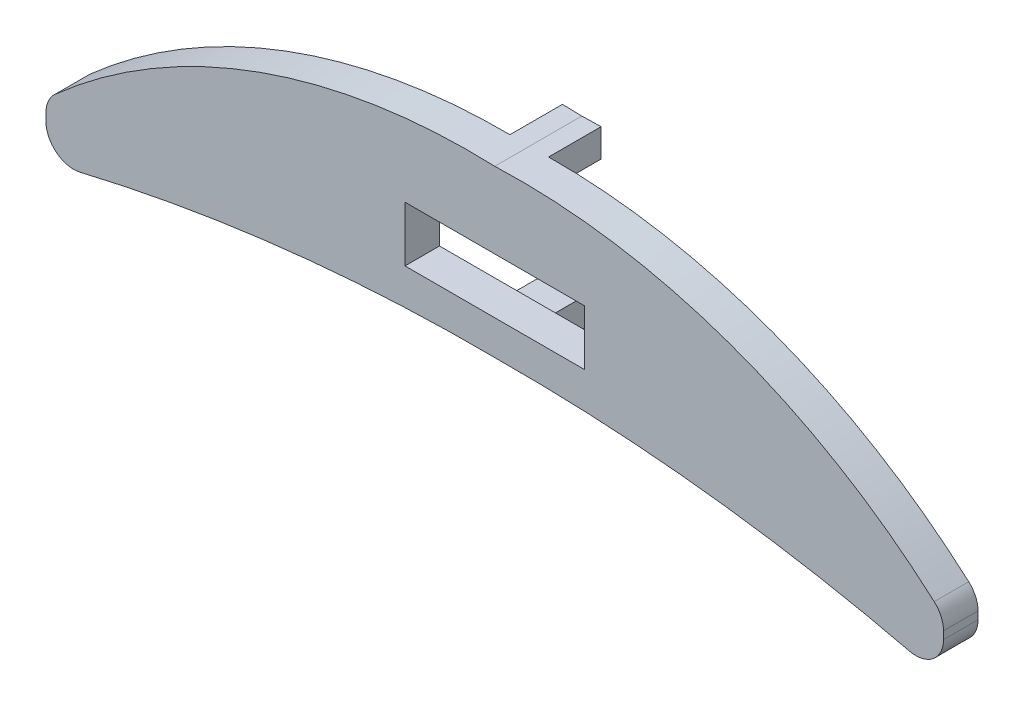
ISO-10303-21;
HEADER;
FILE_DESCRIPTION(('STEP AP214'),'2;1');
FILE_NAME('part.step','',(''),(''),'','','');
FILE_SCHEMA(('AUTOMOTIVE_DESIGN { 1 0 10303 214 1 1 1 1 }'));
ENDSEC;
DATA;
#1=APPLICATION_CONTEXT('core data for automotive mechanical design processes');
#2=APPLICATION_PROTOCOL_DEFINITION('international standard','automotive_design',2000,#1);
#3=PRODUCT_CONTEXT('',#1,'mechanical');
#4=PRODUCT('Part','Part','',(#3));
#5=PRODUCT_RELATED_PRODUCT_CATEGORY('part','',(#4));
#6=PRODUCT_DEFINITION_FORMATION('','',#4);
#7=PRODUCT_DEFINITION_CONTEXT('part definition',#1,'design');
#8=PRODUCT_DEFINITION('design','',#6,#7);
#9=PRODUCT_DEFINITION_SHAPE('','',#8);
#10=(LENGTH_UNIT() NAMED_UNIT(*) SI_UNIT(.MILLI.,.METRE.));
#11=(NAMED_UNIT(*) PLANE_ANGLE_UNIT() SI_UNIT($,.RADIAN.));
#12=(NAMED_UNIT(*) SI_UNIT($,.STERADIAN.) SOLID_ANGLE_UNIT());
#13=UNCERTAINTY_MEASURE_WITH_UNIT(LENGTH_MEASURE(1.E-05),#10,'distance_accuracy_value','');
#14=(GEOMETRIC_REPRESENTATION_CONTEXT(3) GLOBAL_UNCERTAINTY_ASSIGNED_CONTEXT((#13)) GLOBAL_UNIT_ASSIGNED_CONTEXT((#10,
#11,#12)) REPRESENTATION_CONTEXT('',''));
#15=CARTESIAN_POINT('',(0.,0.,0.));
#16=DIRECTION('',(0.,0.,1.));
#17=DIRECTION('',(1.,0.,0.));
#18=AXIS2_PLACEMENT_3D('',#15,#16,#17);
#19=CARTESIAN_POINT('',(-34.2647186257615,-33.2309703885627,2.5));
#20=DIRECTION('',(0.,0.,-1.));
#21=DIRECTION('',(-1.,0.,0.));
#22=AXIS2_PLACEMENT_3D('',#19,#20,#21);
#23=CYLINDRICAL_SURFACE('',#22,45.2653831765417);
#24=CARTESIAN_POINT('',(-34.2647186257615,-33.2309703885627,0.));
#25=DIRECTION('',(0.,0.,1.));
#26=DIRECTION('',(1.,0.,0.));
#27=AXIS2_PLACEMENT_3D('',#24,#25,#26);
#28=CIRCLE('',#27,45.2653831765417);
#29=CARTESIAN_POINT('',(-64.3283266789519,0.60886390392887,0.));
#30=VERTEX_POINT('',#29);
#31=CARTESIAN_POINT('',(-33.9,12.0329434329703,0.));
#32=VERTEX_POINT('',#31);
#33=EDGE_CURVE('E303',#30,#32,#28,.F.);
#34=ORIENTED_EDGE('',*,*,#33,.F.);
#35=CARTESIAN_POINT('',(-64.3283266789519,0.608863903928872,2.625));
#36=CARTESIAN_POINT('',(-64.3283266789519,0.608863903928872,1.70833333333333));
#37=CARTESIAN_POINT('',(-64.3283266789519,0.608863903928872,0.791666666666668));
#38=CARTESIAN_POINT('',(-64.3283266789519,0.608863903928872,-0.125));
#39=(BOUNDED_CURVE() B_SPLINE_CURVE(3,(#35,#36,#37,#38),.UNSPECIFIED.,.F.,
.F.) B_SPLINE_CURVE_WITH_KNOTS((4,4),(-0.000125,0.002625),
.UNSPECIFIED.) CURVE() GEOMETRIC_REPRESENTATION_ITEM() RATIONAL_B_SPLINE_CURVE((1.,1.,1.,1.)) REPRESENTATION_ITEM(''));
#40=CARTESIAN_POINT('',(-64.3283266789519,0.608863903928857,2.5));
#41=VERTEX_POINT('',#40);
#42=EDGE_CURVE('E11',#30,#41,#39,.F.);
#43=ORIENTED_EDGE('',*,*,#42,.T.);
#44=CARTESIAN_POINT('',(-34.2647186257615,-33.2309703885627,2.5));
#45=DIRECTION('',(0.,0.,1.));
#46=DIRECTION('',(1.,0.,0.));
#47=AXIS2_PLACEMENT_3D('',#44,#45,#46);
#48=CIRCLE('',#47,45.2653831765417);
#49=CARTESIAN_POINT('',(-32.5,12.,2.5));
#50=VERTEX_POINT('',#49);
#51=EDGE_CURVE('E315',#41,#50,#48,.F.);
#52=ORIENTED_EDGE('',*,*,#51,.T.);
#53=DIRECTION('',(0.,0.,-1.));
#54=VECTOR('',#53,1.);
#55=CARTESIAN_POINT('',(-32.5,12.,2.5));
#56=LINE('',#55,#54);
#57=CARTESIAN_POINT('',(-32.5,12.,-3.8));
#58=VERTEX_POINT('',#57);
#59=EDGE_CURVE('E549',#50,#58,#56,.T.);
#60=ORIENTED_EDGE('',*,*,#59,.T.);
#61=CARTESIAN_POINT('',(-34.2647186257615,-33.2309703885627,-3.8));
#62=DIRECTION('',(0.,0.,-1.));
#63=DIRECTION('',(-1.,0.,0.));
#64=AXIS2_PLACEMENT_3D('',#61,#62,#63);
#65=CIRCLE('',#64,45.2653831765417);
#66=CARTESIAN_POINT('',(-33.9,12.0329434329703,-3.8));
#67=VERTEX_POINT('',#66);
#68=EDGE_CURVE('E255',#67,#58,#65,.T.);
#69=ORIENTED_EDGE('',*,*,#68,.F.);
#70=DIRECTION('',(0.,0.,1.));
#71=VECTOR('',#70,1.);
#72=CARTESIAN_POINT('',(-33.9,12.0329434329703,-3.8));
#73=LINE('',#72,#71);
#74=EDGE_CURVE('E270',#67,#32,#73,.T.);
#75=ORIENTED_EDGE('',*,*,#74,.T.);
#76=EDGE_LOOP('',(#34,#43,#52,#60,#69,#75));
#77=FACE_BOUND('',#76,.T.);
#78=ADVANCED_FACE('F35',(#77),#23,.T.);
#79=CARTESIAN_POINT('',(-65.,0.,2.5));
#80=DIRECTION('',(1.,0.,0.));
#81=DIRECTION('',(0.,0.,-1.));
#82=AXIS2_PLACEMENT_3D('',#79,#80,#81);
#83=PLANE('',#82);
#84=DIRECTION('',(0.,-1.,0.));
#85=VECTOR('',#84,1.);
#86=CARTESIAN_POINT('',(-65.,0.,0.));
#87=LINE('',#86,#85);
#88=CARTESIAN_POINT('',(-65.,-0.886311080474163,0.));
#89=VERTEX_POINT('',#88);
#90=CARTESIAN_POINT('',(-65.,-1.44311489166448,0.));
#91=VERTEX_POINT('',#90);
#92=EDGE_CURVE('E646',#89,#91,#87,.T.);
#93=ORIENTED_EDGE('',*,*,#92,.T.);
#94=CARTESIAN_POINT('',(-65.,-1.44311489166448,2.625));
#95=CARTESIAN_POINT('',(-65.,-1.44311489166448,1.70833333333333));
#96=CARTESIAN_POINT('',(-65.,-1.44311489166448,0.791666666666668));
#97=CARTESIAN_POINT('',(-65.,-1.44311489166448,-0.125));
#98=(BOUNDED_CURVE() B_SPLINE_CURVE(3,(#94,#95,#96,#97),.UNSPECIFIED.,.F.,
.F.) B_SPLINE_CURVE_WITH_KNOTS((4,4),(-0.000125,0.002625),
.UNSPECIFIED.) CURVE() GEOMETRIC_REPRESENTATION_ITEM() RATIONAL_B_SPLINE_CURVE((1.,1.,1.,1.)) REPRESENTATION_ITEM(''));
#99=CARTESIAN_POINT('',(-65.,-1.44311489166448,2.5));
#100=VERTEX_POINT('',#99);
#101=EDGE_CURVE('E48',#91,#100,#98,.F.);
#102=ORIENTED_EDGE('',*,*,#101,.T.);
#103=DIRECTION('',(0.,-1.,0.));
#104=VECTOR('',#103,1.);
#105=CARTESIAN_POINT('',(-65.,0.,2.5));
#106=LINE('',#105,#104);
#107=CARTESIAN_POINT('',(-65.,-0.886311080474163,2.5));
#108=VERTEX_POINT('',#107);
#109=EDGE_CURVE('E319',#108,#100,#106,.T.);
#110=ORIENTED_EDGE('',*,*,#109,.F.);
#111=CARTESIAN_POINT('',(-65.,-0.886311080474163,-0.125));
#112=CARTESIAN_POINT('',(-65.,-0.886311080474163,0.791666666666668));
#113=CARTESIAN_POINT('',(-65.,-0.886311080474163,1.70833333333333));
#114=CARTESIAN_POINT('',(-65.,-0.886311080474163,2.625));
#115=(BOUNDED_CURVE() B_SPLINE_CURVE(3,(#111,#112,#113,#114),.UNSPECIFIED.,.F.,
.F.) B_SPLINE_CURVE_WITH_KNOTS((4,4),(-0.000125,0.002625),
.UNSPECIFIED.) CURVE() GEOMETRIC_REPRESENTATION_ITEM() RATIONAL_B_SPLINE_CURVE((1.,1.,1.,1.)) REPRESENTATION_ITEM(''));
#116=EDGE_CURVE('E523',#108,#89,#115,.F.);
#117=ORIENTED_EDGE('',*,*,#116,.T.);
#118=EDGE_LOOP('',(#93,#102,#110,#117));
#119=FACE_BOUND('',#118,.T.);
#120=ADVANCED_FACE('F678',(#119),#83,.F.);
#121=CARTESIAN_POINT('',(-33.5584917745498,-125.431004331783,2.5));
#122=DIRECTION('',(0.,0.,-1.));
#123=DIRECTION('',(-1.,0.,0.));
#124=AXIS2_PLACEMENT_3D('',#121,#122,#123);
#125=CYLINDRICAL_SURFACE('',#124,125.435470471939);
#126=CARTESIAN_POINT('',(-33.5584917745498,-125.431004331783,2.5));
#127=DIRECTION('',(0.,0.,1.));
#128=DIRECTION('',(1.,0.,0.));
#129=AXIS2_PLACEMENT_3D('',#126,#127,#128);
#130=CIRCLE('',#129,125.435470471939);
#131=CARTESIAN_POINT('',(-62.5379385642566,-3.38900780485338,2.5));
#132=VERTEX_POINT('',#131);
#133=CARTESIAN_POINT('',(-32.5,0.,2.5));
#134=VERTEX_POINT('',#133);
#135=EDGE_CURVE('E326',#132,#134,#130,.F.);
#136=ORIENTED_EDGE('',*,*,#135,.F.);
#137=CARTESIAN_POINT('',(-62.5379385642566,-3.38900780485337,-0.125));
#138=CARTESIAN_POINT('',(-62.5379385642566,-3.38900780485337,0.791666666666668));
#139=CARTESIAN_POINT('',(-62.5379385642566,-3.38900780485337,1.70833333333333));
#140=CARTESIAN_POINT('',(-62.5379385642566,-3.38900780485337,2.625));
#141=(BOUNDED_CURVE() B_SPLINE_CURVE(3,(#137,#138,#139,#140),.UNSPECIFIED.,.F.,
.F.) B_SPLINE_CURVE_WITH_KNOTS((4,4),(-0.000125,0.002625),
.UNSPECIFIED.) CURVE() GEOMETRIC_REPRESENTATION_ITEM() RATIONAL_B_SPLINE_CURVE((1.,1.,1.,1.)) REPRESENTATION_ITEM(''));
#142=CARTESIAN_POINT('',(-62.5379385642566,-3.38900780485338,0.));
#143=VERTEX_POINT('',#142);
#144=EDGE_CURVE('E644',#132,#143,#141,.F.);
#145=ORIENTED_EDGE('',*,*,#144,.T.);
#146=CARTESIAN_POINT('',(-33.5584917745498,-125.431004331783,0.));
#147=DIRECTION('',(0.,0.,1.));
#148=DIRECTION('',(1.,0.,0.));
#149=AXIS2_PLACEMENT_3D('',#146,#147,#148);
#150=CIRCLE('',#149,125.435470471939);
#151=CARTESIAN_POINT('',(-32.5,0.,0.));
#152=VERTEX_POINT('',#151);
#153=EDGE_CURVE('E590',#143,#152,#150,.F.);
#154=ORIENTED_EDGE('',*,*,#153,.T.);
#155=DIRECTION('',(0.,0.,-1.));
#156=VECTOR('',#155,1.);
#157=CARTESIAN_POINT('',(-32.5,0.,2.5));
#158=LINE('',#157,#156);
#159=EDGE_CURVE('E550',#134,#152,#158,.T.);
#160=ORIENTED_EDGE('',*,*,#159,.F.);
#161=EDGE_LOOP('',(#136,#145,#154,#160));
#162=FACE_BOUND('',#161,.T.);
#163=ADVANCED_FACE('F643',(#162),#125,.F.);
#164=CARTESIAN_POINT('',(-31.4415082254502,-125.431004331783,2.5));
#165=DIRECTION('',(0.,0.,-1.));
#166=DIRECTION('',(-1.,0.,0.));
#167=AXIS2_PLACEMENT_3D('',#164,#165,#166);
#168=CYLINDRICAL_SURFACE('',#167,125.435470471939);
#169=CARTESIAN_POINT('',(-31.4415082254502,-125.431004331783,0.));
#170=DIRECTION('',(0.,0.,1.));
#171=DIRECTION('',(1.,0.,0.));
#172=AXIS2_PLACEMENT_3D('',#169,#170,#171);
#173=CIRCLE('',#172,125.435470471939);
#174=CARTESIAN_POINT('',(-2.46206143574342,-3.38900780485336,0.));
#175=VERTEX_POINT('',#174);
#176=EDGE_CURVE('E354',#175,#152,#173,.T.);
#177=ORIENTED_EDGE('',*,*,#176,.F.);
#178=CARTESIAN_POINT('',(-2.46206143574342,-3.38900780485337,2.625));
#179=CARTESIAN_POINT('',(-2.46206143574342,-3.38900780485337,1.70833333333333));
#180=CARTESIAN_POINT('',(-2.46206143574342,-3.38900780485337,0.791666666666668));
#181=CARTESIAN_POINT('',(-2.46206143574342,-3.38900780485337,-0.125));
#182=(BOUNDED_CURVE() B_SPLINE_CURVE(3,(#178,#179,#180,#181),.UNSPECIFIED.,.F.,
.F.) B_SPLINE_CURVE_WITH_KNOTS((4,4),(-0.000125,0.002625),
.UNSPECIFIED.) CURVE() GEOMETRIC_REPRESENTATION_ITEM() RATIONAL_B_SPLINE_CURVE((1.,1.,1.,1.)) REPRESENTATION_ITEM(''));
#183=CARTESIAN_POINT('',(-2.46206143574342,-3.38900780485336,2.5));
#184=VERTEX_POINT('',#183);
#185=EDGE_CURVE('E348',#175,#184,#182,.F.);
#186=ORIENTED_EDGE('',*,*,#185,.T.);
#187=CARTESIAN_POINT('',(-31.4415082254502,-125.431004331783,2.5));
#188=DIRECTION('',(0.,0.,1.));
#189=DIRECTION('',(1.,0.,0.));
#190=AXIS2_PLACEMENT_3D('',#187,#188,#189);
#191=CIRCLE('',#190,125.435470471939);
#192=EDGE_CURVE('E328',#184,#134,#191,.T.);
#193=ORIENTED_EDGE('',*,*,#192,.T.);
#194=ORIENTED_EDGE('',*,*,#159,.T.);
#195=EDGE_LOOP('',(#177,#186,#193,#194));
#196=FACE_BOUND('',#195,.T.);
#197=ADVANCED_FACE('F350',(#196),#168,.F.);
#198=CARTESIAN_POINT('',(0.,0.,2.5));
#199=DIRECTION('',(1.,0.,0.));
#200=DIRECTION('',(0.,0.,-1.));
#201=AXIS2_PLACEMENT_3D('',#198,#199,#200);
#202=PLANE('',#201);
#203=DIRECTION('',(0.,-1.,0.));
#204=VECTOR('',#203,1.);
#205=CARTESIAN_POINT('',(0.,0.,2.5));
#206=LINE('',#205,#204);
#207=CARTESIAN_POINT('',(0.,-0.886311080474161,2.5));
#208=VERTEX_POINT('',#207);
#209=CARTESIAN_POINT('',(0.,-1.44311489166448,2.5));
#210=VERTEX_POINT('',#209);
#211=EDGE_CURVE('E340',#208,#210,#206,.T.);
#212=ORIENTED_EDGE('',*,*,#211,.T.);
#213=CARTESIAN_POINT('',(0.,-1.44311489166448,-0.125));
#214=CARTESIAN_POINT('',(0.,-1.44311489166448,0.791666666666668));
#215=CARTESIAN_POINT('',(0.,-1.44311489166448,1.70833333333333));
#216=CARTESIAN_POINT('',(0.,-1.44311489166448,2.625));
#217=(BOUNDED_CURVE() B_SPLINE_CURVE(3,(#213,#214,#215,#216),.UNSPECIFIED.,.F.,
.F.) B_SPLINE_CURVE_WITH_KNOTS((4,4),(-0.000125,0.002625),
.UNSPECIFIED.) CURVE() GEOMETRIC_REPRESENTATION_ITEM() RATIONAL_B_SPLINE_CURVE((1.,1.,1.,1.)) REPRESENTATION_ITEM(''));
#218=CARTESIAN_POINT('',(0.,-1.44311489166448,0.));
#219=VERTEX_POINT('',#218);
#220=EDGE_CURVE('E368',#210,#219,#217,.F.);
#221=ORIENTED_EDGE('',*,*,#220,.T.);
#222=DIRECTION('',(0.,-1.,0.));
#223=VECTOR('',#222,1.);
#224=CARTESIAN_POINT('',(0.,0.,0.));
#225=LINE('',#224,#223);
#226=CARTESIAN_POINT('',(0.,-0.886311080474161,0.));
#227=VERTEX_POINT('',#226);
#228=EDGE_CURVE('E556',#227,#219,#225,.T.);
#229=ORIENTED_EDGE('',*,*,#228,.F.);
#230=CARTESIAN_POINT('',(0.,-0.886311080474161,2.625));
#231=CARTESIAN_POINT('',(0.,-0.886311080474161,1.70833333333333));
#232=CARTESIAN_POINT('',(0.,-0.886311080474161,0.791666666666668));
#233=CARTESIAN_POINT('',(0.,-0.886311080474161,-0.125));
#234=(BOUNDED_CURVE() B_SPLINE_CURVE(3,(#230,#231,#232,#233),.UNSPECIFIED.,.F.,
.F.) B_SPLINE_CURVE_WITH_KNOTS((4,4),(-0.000125,0.002625),
.UNSPECIFIED.) CURVE() GEOMETRIC_REPRESENTATION_ITEM() RATIONAL_B_SPLINE_CURVE((1.,1.,1.,1.)) REPRESENTATION_ITEM(''));
#235=EDGE_CURVE('E449',#227,#208,#234,.F.);
#236=ORIENTED_EDGE('',*,*,#235,.T.);
#237=EDGE_LOOP('',(#212,#221,#229,#236));
#238=FACE_BOUND('',#237,.T.);
#239=ADVANCED_FACE('F566',(#238),#202,.T.);
#240=CARTESIAN_POINT('',(-30.7352813742385,-33.2309703885627,2.5));
#241=DIRECTION('',(0.,0.,-1.));
#242=DIRECTION('',(-1.,0.,0.));
#243=AXIS2_PLACEMENT_3D('',#240,#241,#242);
#244=CYLINDRICAL_SURFACE('',#243,45.2653831765417);
#245=CARTESIAN_POINT('',(-30.7352813742385,-33.2309703885627,2.5));
#246=DIRECTION('',(0.,0.,1.));
#247=DIRECTION('',(1.,0.,0.));
#248=AXIS2_PLACEMENT_3D('',#245,#246,#247);
#249=CIRCLE('',#248,45.2653831765417);
#250=CARTESIAN_POINT('',(-0.671673321048099,0.608863903928863,2.5));
#251=VERTEX_POINT('',#250);
#252=EDGE_CURVE('E329',#251,#50,#249,.T.);
#253=ORIENTED_EDGE('',*,*,#252,.F.);
#254=CARTESIAN_POINT('',(-0.671673321048094,0.608863903928869,-0.125));
#255=CARTESIAN_POINT('',(-0.671673321048094,0.608863903928869,0.791666666666668));
#256=CARTESIAN_POINT('',(-0.671673321048094,0.608863903928869,1.70833333333333));
#257=CARTESIAN_POINT('',(-0.671673321048094,0.608863903928869,2.625));
#258=(BOUNDED_CURVE() B_SPLINE_CURVE(3,(#254,#255,#256,#257),.UNSPECIFIED.,.F.,
.F.) B_SPLINE_CURVE_WITH_KNOTS((4,4),(-0.000125,0.002625),
.UNSPECIFIED.) CURVE() GEOMETRIC_REPRESENTATION_ITEM() RATIONAL_B_SPLINE_CURVE((1.,1.,1.,1.)) REPRESENTATION_ITEM(''));
#259=CARTESIAN_POINT('',(-0.671673321048099,0.608863903928863,0.));
#260=VERTEX_POINT('',#259);
#261=EDGE_CURVE('E370',#251,#260,#258,.F.);
#262=ORIENTED_EDGE('',*,*,#261,.T.);
#263=CARTESIAN_POINT('',(-30.7352813742385,-33.2309703885627,0.));
#264=DIRECTION('',(0.,0.,1.));
#265=DIRECTION('',(1.,0.,0.));
#266=AXIS2_PLACEMENT_3D('',#263,#264,#265);
#267=CIRCLE('',#266,45.2653831765417);
#268=CARTESIAN_POINT('',(-31.1,12.0329434329703,0.));
#269=VERTEX_POINT('',#268);
#270=EDGE_CURVE('E320',#260,#269,#267,.T.);
#271=ORIENTED_EDGE('',*,*,#270,.T.);
#272=DIRECTION('',(0.,0.,1.));
#273=VECTOR('',#272,1.);
#274=CARTESIAN_POINT('',(-31.1,12.0329434329703,-3.8));
#275=LINE('',#274,#273);
#276=CARTESIAN_POINT('',(-31.1,12.0329434329703,-3.8));
#277=VERTEX_POINT('',#276);
#278=EDGE_CURVE('E260',#277,#269,#275,.T.);
#279=ORIENTED_EDGE('',*,*,#278,.F.);
#280=CARTESIAN_POINT('',(-30.7352813742385,-33.2309703885627,-3.8));
#281=DIRECTION('',(0.,0.,-1.));
#282=DIRECTION('',(-1.,0.,0.));
#283=AXIS2_PLACEMENT_3D('',#280,#281,#282);
#284=CIRCLE('',#283,45.2653831765417);
#285=EDGE_CURVE('E258',#58,#277,#284,.T.);
#286=ORIENTED_EDGE('',*,*,#285,.F.);
#287=ORIENTED_EDGE('',*,*,#59,.F.);
#288=EDGE_LOOP('',(#253,#262,#271,#279,#286,#287));
#289=FACE_BOUND('',#288,.T.);
#290=ADVANCED_FACE('F575',(#289),#244,.T.);
#291=CARTESIAN_POINT('',(0.,0.,2.5));
#292=DIRECTION('',(0.,0.,1.));
#293=DIRECTION('',(1.,0.,0.));
#294=AXIS2_PLACEMENT_3D('',#291,#292,#293);
#295=PLANE('',#294);
#296=DIRECTION('',(0.,1.,0.));
#297=VECTOR('',#296,1.);
#298=CARTESIAN_POINT('',(-26.,0.,2.5));
#299=LINE('',#298,#297);
#300=CARTESIAN_POINT('',(-26.,2.5,2.5));
#301=VERTEX_POINT('',#300);
#302=CARTESIAN_POINT('',(-26.,6.5,2.5));
#303=VERTEX_POINT('',#302);
#304=EDGE_CURVE('E278',#301,#303,#299,.T.);
#305=ORIENTED_EDGE('',*,*,#304,.F.);
#306=DIRECTION('',(-1.,0.,0.));
#307=VECTOR('',#306,1.);
#308=CARTESIAN_POINT('',(0.,2.5,2.5));
#309=LINE('',#308,#307);
#310=CARTESIAN_POINT('',(-39.,2.5,2.5));
#311=VERTEX_POINT('',#310);
#312=EDGE_CURVE('E283',#301,#311,#309,.T.);
#313=ORIENTED_EDGE('',*,*,#312,.T.);
#314=DIRECTION('',(0.,1.,0.));
#315=VECTOR('',#314,1.);
#316=CARTESIAN_POINT('',(-39.,0.,2.5));
#317=LINE('',#316,#315);
#318=CARTESIAN_POINT('',(-39.,6.5,2.5));
#319=VERTEX_POINT('',#318);
#320=EDGE_CURVE('E296',#311,#319,#317,.T.);
#321=ORIENTED_EDGE('',*,*,#320,.T.);
#322=DIRECTION('',(-1.,0.,0.));
#323=VECTOR('',#322,1.);
#324=CARTESIAN_POINT('',(0.,6.5,2.5));
#325=LINE('',#324,#323);
#326=EDGE_CURVE('E293',#303,#319,#325,.T.);
#327=ORIENTED_EDGE('',*,*,#326,.F.);
#328=EDGE_LOOP('',(#305,#313,#321,#327));
#329=FACE_BOUND('',#328,.T.);
#330=ORIENTED_EDGE('',*,*,#192,.F.);
#331=CARTESIAN_POINT('',(0.,-1.44311489166448,2.5));
#332=CARTESIAN_POINT('',(0.,-3.97363588699372,2.5));
#333=CARTESIAN_POINT('',(-2.46206143574342,-3.38900780485337,2.5));
#334=(BOUNDED_CURVE() B_SPLINE_CURVE(2,(#331,#332,#333),.UNSPECIFIED.,.F.,
.F.) B_SPLINE_CURVE_WITH_KNOTS((3,3),(0.,1.),
.UNSPECIFIED.) CURVE() GEOMETRIC_REPRESENTATION_ITEM() RATIONAL_B_SPLINE_CURVE((1.,
0.620068255165626,1.)) REPRESENTATION_ITEM(''));
#335=EDGE_CURVE('E361',#184,#210,#334,.F.);
#336=ORIENTED_EDGE('',*,*,#335,.T.);
#337=ORIENTED_EDGE('',*,*,#211,.F.);
#338=CARTESIAN_POINT('',(-0.671673321048094,0.608863903928869,2.5));
#339=CARTESIAN_POINT('',(0.,0.0121433854641779,2.5));
#340=CARTESIAN_POINT('',(0.,-0.886311080474161,2.5));
#341=(BOUNDED_CURVE() B_SPLINE_CURVE(2,(#338,#339,#340),.UNSPECIFIED.,.F.,
.F.) B_SPLINE_CURVE_WITH_KNOTS((3,3),(0.,1.),
.UNSPECIFIED.) CURVE() GEOMETRIC_REPRESENTATION_ITEM() RATIONAL_B_SPLINE_CURVE((1.,
0.912185107167387,1.)) REPRESENTATION_ITEM(''));
#342=EDGE_CURVE('E55',#208,#251,#341,.F.);
#343=ORIENTED_EDGE('',*,*,#342,.T.);
#344=ORIENTED_EDGE('',*,*,#252,.T.);
#345=ORIENTED_EDGE('',*,*,#51,.F.);
#346=CARTESIAN_POINT('',(-65.,-0.886311080474163,2.5));
#347=CARTESIAN_POINT('',(-65.,0.0121433854641782,2.5));
#348=CARTESIAN_POINT('',(-64.3283266789519,0.608863903928872,2.5));
#349=(BOUNDED_CURVE() B_SPLINE_CURVE(2,(#346,#347,#348),.UNSPECIFIED.,.F.,
.F.) B_SPLINE_CURVE_WITH_KNOTS((3,3),(0.,1.),
.UNSPECIFIED.) CURVE() GEOMETRIC_REPRESENTATION_ITEM() RATIONAL_B_SPLINE_CURVE((1.,
0.912185107167386,1.)) REPRESENTATION_ITEM(''));
#350=EDGE_CURVE('E358',#41,#108,#349,.F.);
#351=ORIENTED_EDGE('',*,*,#350,.T.);
#352=ORIENTED_EDGE('',*,*,#109,.T.);
#353=CARTESIAN_POINT('',(-62.5379385642566,-3.38900780485337,2.5));
#354=CARTESIAN_POINT('',(-65.,-3.97363588699369,2.5));
#355=CARTESIAN_POINT('',(-65.,-1.44311489166448,2.5));
#356=(BOUNDED_CURVE() B_SPLINE_CURVE(2,(#353,#354,#355),.UNSPECIFIED.,.F.,
.F.) B_SPLINE_CURVE_WITH_KNOTS((3,3),(0.,1.),
.UNSPECIFIED.) CURVE() GEOMETRIC_REPRESENTATION_ITEM() RATIONAL_B_SPLINE_CURVE((1.,
0.620068255165631,1.)) REPRESENTATION_ITEM(''));
#357=EDGE_CURVE('E63',#100,#132,#356,.F.);
#358=ORIENTED_EDGE('',*,*,#357,.T.);
#359=ORIENTED_EDGE('',*,*,#135,.T.);
#360=EDGE_LOOP('',(#330,#336,#337,#343,#344,#345,#351,#352,#358,#359));
#361=FACE_BOUND('',#360,.T.);
#362=ADVANCED_FACE('F360',(#329,#361),#295,.T.);
#363=CARTESIAN_POINT('',(0.,0.,0.));
#364=DIRECTION('',(0.,0.,1.));
#365=DIRECTION('',(1.,0.,0.));
#366=AXIS2_PLACEMENT_3D('',#363,#364,#365);
#367=PLANE('',#366);
#368=ORIENTED_EDGE('',*,*,#228,.T.);
#369=CARTESIAN_POINT('',(-2.46206143574342,-3.38900780485337,0.));
#370=CARTESIAN_POINT('',(0.,-3.97363588699372,0.));
#371=CARTESIAN_POINT('',(0.,-1.44311489166448,0.));
#372=(BOUNDED_CURVE() B_SPLINE_CURVE(2,(#369,#370,#371),.UNSPECIFIED.,.F.,
.F.) B_SPLINE_CURVE_WITH_KNOTS((3,3),(0.,1.),
.UNSPECIFIED.) CURVE() GEOMETRIC_REPRESENTATION_ITEM() RATIONAL_B_SPLINE_CURVE((1.,
0.620068255165626,1.)) REPRESENTATION_ITEM(''));
#373=EDGE_CURVE('E359',#219,#175,#372,.F.);
#374=ORIENTED_EDGE('',*,*,#373,.T.);
#375=ORIENTED_EDGE('',*,*,#176,.T.);
#376=CARTESIAN_POINT('',(-30.4807394447683,-117.624757988743,0.));
#377=DIRECTION('',(0.,0.,-1.));
#378=DIRECTION('',(-1.,0.,0.));
#379=AXIS2_PLACEMENT_3D('',#376,#377,#378);
#380=CIRCLE('',#379,117.64208900347);
#381=CARTESIAN_POINT('',(-31.1,0.0157011291345156,0.));
#382=VERTEX_POINT('',#381);
#383=EDGE_CURVE('E201',#152,#382,#380,.T.);
#384=ORIENTED_EDGE('',*,*,#383,.T.);
#385=DIRECTION('',(0.,-1.,0.));
#386=VECTOR('',#385,1.);
#387=CARTESIAN_POINT('',(-31.1,0.,0.));
#388=LINE('',#387,#386);
#389=CARTESIAN_POINT('',(-31.1,2.00561930192031,0.));
#390=VERTEX_POINT('',#389);
#391=EDGE_CURVE('E220',#390,#382,#388,.T.);
#392=ORIENTED_EDGE('',*,*,#391,.F.);
#393=DIRECTION('',(1.,0.,0.));
#394=VECTOR('',#393,1.);
#395=CARTESIAN_POINT('',(0.,2.00561930192031,0.));
#396=LINE('',#395,#394);
#397=CARTESIAN_POINT('',(-33.9,2.00561930192031,0.));
#398=VERTEX_POINT('',#397);
#399=EDGE_CURVE('E223',#398,#390,#396,.T.);
#400=ORIENTED_EDGE('',*,*,#399,.F.);
#401=DIRECTION('',(0.,-1.,0.));
#402=VECTOR('',#401,1.);
#403=CARTESIAN_POINT('',(-33.9,0.,0.));
#404=LINE('',#403,#402);
#405=CARTESIAN_POINT('',(-33.9,0.0157011291345156,0.));
#406=VERTEX_POINT('',#405);
#407=EDGE_CURVE('E234',#398,#406,#404,.T.);
#408=ORIENTED_EDGE('',*,*,#407,.T.);
#409=CARTESIAN_POINT('',(-34.5192605552317,-117.624757988743,0.));
#410=DIRECTION('',(0.,0.,-1.));
#411=DIRECTION('',(-1.,0.,0.));
#412=AXIS2_PLACEMENT_3D('',#409,#410,#411);
#413=CIRCLE('',#412,117.64208900347);
#414=EDGE_CURVE('E232',#152,#406,#413,.F.);
#415=ORIENTED_EDGE('',*,*,#414,.F.);
#416=ORIENTED_EDGE('',*,*,#153,.F.);
#417=CARTESIAN_POINT('',(-65.,-1.44311489166448,0.));
#418=CARTESIAN_POINT('',(-65.,-3.97363588699369,0.));
#419=CARTESIAN_POINT('',(-62.5379385642566,-3.38900780485337,0.));
#420=(BOUNDED_CURVE() B_SPLINE_CURVE(2,(#417,#418,#419),.UNSPECIFIED.,.F.,
.F.) B_SPLINE_CURVE_WITH_KNOTS((3,3),(0.,1.),
.UNSPECIFIED.) CURVE() GEOMETRIC_REPRESENTATION_ITEM() RATIONAL_B_SPLINE_CURVE((1.,
0.620068255165631,1.)) REPRESENTATION_ITEM(''));
#421=EDGE_CURVE('E462',#143,#91,#420,.F.);
#422=ORIENTED_EDGE('',*,*,#421,.T.);
#423=ORIENTED_EDGE('',*,*,#92,.F.);
#424=CARTESIAN_POINT('',(-64.3283266789519,0.608863903928872,0.));
#425=CARTESIAN_POINT('',(-65.,0.0121433854641782,0.));
#426=CARTESIAN_POINT('',(-65.,-0.886311080474163,0.));
#427=(BOUNDED_CURVE() B_SPLINE_CURVE(2,(#424,#425,#426),.UNSPECIFIED.,.F.,
.F.) B_SPLINE_CURVE_WITH_KNOTS((3,3),(0.,1.),
.UNSPECIFIED.) CURVE() GEOMETRIC_REPRESENTATION_ITEM() RATIONAL_B_SPLINE_CURVE((1.,
0.912185107167386,1.)) REPRESENTATION_ITEM(''));
#428=EDGE_CURVE('E511',#89,#30,#427,.F.);
#429=ORIENTED_EDGE('',*,*,#428,.T.);
#430=ORIENTED_EDGE('',*,*,#33,.T.);
#431=DIRECTION('',(0.,1.,0.));
#432=VECTOR('',#431,1.);
#433=CARTESIAN_POINT('',(-33.9,0.,0.));
#434=LINE('',#433,#432);
#435=CARTESIAN_POINT('',(-33.9,10.,0.));
#436=VERTEX_POINT('',#435);
#437=EDGE_CURVE('E250',#436,#32,#434,.T.);
#438=ORIENTED_EDGE('',*,*,#437,.F.);
#439=DIRECTION('',(1.,0.,0.));
#440=VECTOR('',#439,1.);
#441=CARTESIAN_POINT('',(0.,10.,0.));
#442=LINE('',#441,#440);
#443=CARTESIAN_POINT('',(-31.1,10.,0.));
#444=VERTEX_POINT('',#443);
#445=EDGE_CURVE('E263',#436,#444,#442,.T.);
#446=ORIENTED_EDGE('',*,*,#445,.T.);
#447=DIRECTION('',(0.,1.,0.));
#448=VECTOR('',#447,1.);
#449=CARTESIAN_POINT('',(-31.1,0.,0.));
#450=LINE('',#449,#448);
#451=EDGE_CURVE('E204',#444,#269,#450,.T.);
#452=ORIENTED_EDGE('',*,*,#451,.T.);
#453=ORIENTED_EDGE('',*,*,#270,.F.);
#454=CARTESIAN_POINT('',(0.,-0.886311080474161,0.));
#455=CARTESIAN_POINT('',(0.,0.0121433854641779,0.));
#456=CARTESIAN_POINT('',(-0.671673321048094,0.608863903928869,0.));
#457=(BOUNDED_CURVE() B_SPLINE_CURVE(2,(#454,#455,#456),.UNSPECIFIED.,.F.,
.F.) B_SPLINE_CURVE_WITH_KNOTS((3,3),(0.,1.),
.UNSPECIFIED.) CURVE() GEOMETRIC_REPRESENTATION_ITEM() RATIONAL_B_SPLINE_CURVE((1.,
0.912185107167387,1.)) REPRESENTATION_ITEM(''));
#458=EDGE_CURVE('E420',#260,#227,#457,.F.);
#459=ORIENTED_EDGE('',*,*,#458,.T.);
#460=EDGE_LOOP('',(#368,#374,#375,#384,#392,#400,#408,#415,#416,#422,#423,#429,#430,#438,#446,
#452,#453,#459));
#461=FACE_BOUND('',#460,.T.);
#462=DIRECTION('',(-1.,0.,0.));
#463=VECTOR('',#462,1.);
#464=CARTESIAN_POINT('',(0.,2.5,0.));
#465=LINE('',#464,#463);
#466=CARTESIAN_POINT('',(-26.,2.5,0.));
#467=VERTEX_POINT('',#466);
#468=CARTESIAN_POINT('',(-39.,2.5,0.));
#469=VERTEX_POINT('',#468);
#470=EDGE_CURVE('E289',#467,#469,#465,.T.);
#471=ORIENTED_EDGE('',*,*,#470,.F.);
#472=DIRECTION('',(0.,1.,0.));
#473=VECTOR('',#472,1.);
#474=CARTESIAN_POINT('',(-26.,0.,0.));
#475=LINE('',#474,#473);
#476=CARTESIAN_POINT('',(-26.,6.5,0.));
#477=VERTEX_POINT('',#476);
#478=EDGE_CURVE('E279',#467,#477,#475,.T.);
#479=ORIENTED_EDGE('',*,*,#478,.T.);
#480=DIRECTION('',(-1.,0.,0.));
#481=VECTOR('',#480,1.);
#482=CARTESIAN_POINT('',(0.,6.5,0.));
#483=LINE('',#482,#481);
#484=CARTESIAN_POINT('',(-39.,6.5,0.));
#485=VERTEX_POINT('',#484);
#486=EDGE_CURVE('E282',#477,#485,#483,.T.);
#487=ORIENTED_EDGE('',*,*,#486,.T.);
#488=DIRECTION('',(0.,1.,0.));
#489=VECTOR('',#488,1.);
#490=CARTESIAN_POINT('',(-39.,0.,0.));
#491=LINE('',#490,#489);
#492=EDGE_CURVE('E286',#469,#485,#491,.T.);
#493=ORIENTED_EDGE('',*,*,#492,.F.);
#494=EDGE_LOOP('',(#471,#479,#487,#493));
#495=FACE_BOUND('',#494,.T.);
#496=ADVANCED_FACE('F610',(#461,#495),#367,.F.);
#497=CARTESIAN_POINT('',(-26.,0.,0.));
#498=DIRECTION('',(1.,0.,0.));
#499=DIRECTION('',(0.,0.,-1.));
#500=AXIS2_PLACEMENT_3D('',#497,#498,#499);
#501=PLANE('',#500);
#502=ORIENTED_EDGE('',*,*,#304,.T.);
#503=DIRECTION('',(0.,0.,1.));
#504=VECTOR('',#503,1.);
#505=CARTESIAN_POINT('',(-26.,6.5,0.));
#506=LINE('',#505,#504);
#507=EDGE_CURVE('E291',#477,#303,#506,.T.);
#508=ORIENTED_EDGE('',*,*,#507,.F.);
#509=ORIENTED_EDGE('',*,*,#478,.F.);
#510=DIRECTION('',(0.,0.,1.));
#511=VECTOR('',#510,1.);
#512=CARTESIAN_POINT('',(-26.,2.5,0.));
#513=LINE('',#512,#511);
#514=EDGE_CURVE('E301',#467,#301,#513,.T.);
#515=ORIENTED_EDGE('',*,*,#514,.T.);
#516=EDGE_LOOP('',(#502,#508,#509,#515));
#517=FACE_BOUND('',#516,.T.);
#518=ADVANCED_FACE('F619',(#517),#501,.F.);
#519=CARTESIAN_POINT('',(0.,2.5,0.));
#520=DIRECTION('',(0.,1.,0.));
#521=DIRECTION('',(0.,0.,1.));
#522=AXIS2_PLACEMENT_3D('',#519,#520,#521);
#523=PLANE('',#522);
#524=ORIENTED_EDGE('',*,*,#312,.F.);
#525=ORIENTED_EDGE('',*,*,#514,.F.);
#526=ORIENTED_EDGE('',*,*,#470,.T.);
#527=DIRECTION('',(0.,0.,1.));
#528=VECTOR('',#527,1.);
#529=CARTESIAN_POINT('',(-39.,2.5,0.));
#530=LINE('',#529,#528);
#531=EDGE_CURVE('E304',#469,#311,#530,.T.);
#532=ORIENTED_EDGE('',*,*,#531,.T.);
#533=EDGE_LOOP('',(#524,#525,#526,#532));
#534=FACE_BOUND('',#533,.T.);
#535=ADVANCED_FACE('F888',(#534),#523,.T.);
#536=CARTESIAN_POINT('',(-39.,0.,0.));
#537=DIRECTION('',(1.,0.,0.));
#538=DIRECTION('',(0.,0.,-1.));
#539=AXIS2_PLACEMENT_3D('',#536,#537,#538);
#540=PLANE('',#539);
#541=ORIENTED_EDGE('',*,*,#320,.F.);
#542=ORIENTED_EDGE('',*,*,#531,.F.);
#543=ORIENTED_EDGE('',*,*,#492,.T.);
#544=DIRECTION('',(0.,0.,1.));
#545=VECTOR('',#544,1.);
#546=CARTESIAN_POINT('',(-39.,6.5,0.));
#547=LINE('',#546,#545);
#548=EDGE_CURVE('E306',#485,#319,#547,.T.);
#549=ORIENTED_EDGE('',*,*,#548,.T.);
#550=EDGE_LOOP('',(#541,#542,#543,#549));
#551=FACE_BOUND('',#550,.T.);
#552=ADVANCED_FACE('F877',(#551),#540,.T.);
#553=CARTESIAN_POINT('',(0.,6.5,0.));
#554=DIRECTION('',(0.,1.,0.));
#555=DIRECTION('',(0.,0.,1.));
#556=AXIS2_PLACEMENT_3D('',#553,#554,#555);
#557=PLANE('',#556);
#558=ORIENTED_EDGE('',*,*,#326,.T.);
#559=ORIENTED_EDGE('',*,*,#548,.F.);
#560=ORIENTED_EDGE('',*,*,#486,.F.);
#561=ORIENTED_EDGE('',*,*,#507,.T.);
#562=EDGE_LOOP('',(#558,#559,#560,#561));
#563=FACE_BOUND('',#562,.T.);
#564=ADVANCED_FACE('F675',(#563),#557,.F.);
#565=CARTESIAN_POINT('',(-31.1,0.,-3.8));
#566=DIRECTION('',(1.,0.,0.));
#567=DIRECTION('',(0.,0.,-1.));
#568=AXIS2_PLACEMENT_3D('',#565,#566,#567);
#569=PLANE('',#568);
#570=ORIENTED_EDGE('',*,*,#451,.F.);
#571=DIRECTION('',(0.,0.,1.));
#572=VECTOR('',#571,1.);
#573=CARTESIAN_POINT('',(-31.1,10.,-3.8));
#574=LINE('',#573,#572);
#575=CARTESIAN_POINT('',(-31.1,10.,-3.8));
#576=VERTEX_POINT('',#575);
#577=EDGE_CURVE('E275',#576,#444,#574,.T.);
#578=ORIENTED_EDGE('',*,*,#577,.F.);
#579=DIRECTION('',(0.,1.,0.));
#580=VECTOR('',#579,1.);
#581=CARTESIAN_POINT('',(-31.1,0.,-3.8));
#582=LINE('',#581,#580);
#583=EDGE_CURVE('E246',#576,#277,#582,.T.);
#584=ORIENTED_EDGE('',*,*,#583,.T.);
#585=ORIENTED_EDGE('',*,*,#278,.T.);
#586=EDGE_LOOP('',(#570,#578,#584,#585));
#587=FACE_BOUND('',#586,.T.);
#588=ADVANCED_FACE('F665',(#587),#569,.T.);
#589=CARTESIAN_POINT('',(0.,10.,-3.8));
#590=DIRECTION('',(0.,-1.,0.));
#591=DIRECTION('',(0.,0.,-1.));
#592=AXIS2_PLACEMENT_3D('',#589,#590,#591);
#593=PLANE('',#592);
#594=ORIENTED_EDGE('',*,*,#445,.F.);
#595=DIRECTION('',(0.,0.,1.));
#596=VECTOR('',#595,1.);
#597=CARTESIAN_POINT('',(-33.9,10.,-3.8));
#598=LINE('',#597,#596);
#599=CARTESIAN_POINT('',(-33.9,10.,-3.8));
#600=VERTEX_POINT('',#599);
#601=EDGE_CURVE('E273',#600,#436,#598,.T.);
#602=ORIENTED_EDGE('',*,*,#601,.F.);
#603=DIRECTION('',(1.,0.,0.));
#604=VECTOR('',#603,1.);
#605=CARTESIAN_POINT('',(0.,10.,-3.8));
#606=LINE('',#605,#604);
#607=EDGE_CURVE('E249',#600,#576,#606,.T.);
#608=ORIENTED_EDGE('',*,*,#607,.T.);
#609=ORIENTED_EDGE('',*,*,#577,.T.);
#610=EDGE_LOOP('',(#594,#602,#608,#609));
#611=FACE_BOUND('',#610,.T.);
#612=ADVANCED_FACE('F667',(#611),#593,.T.);
#613=CARTESIAN_POINT('',(-33.9,0.,-3.8));
#614=DIRECTION('',(1.,0.,0.));
#615=DIRECTION('',(0.,0.,-1.));
#616=AXIS2_PLACEMENT_3D('',#613,#614,#615);
#617=PLANE('',#616);
#618=ORIENTED_EDGE('',*,*,#437,.T.);
#619=ORIENTED_EDGE('',*,*,#74,.F.);
#620=DIRECTION('',(0.,1.,0.));
#621=VECTOR('',#620,1.);
#622=CARTESIAN_POINT('',(-33.9,0.,-3.8));
#623=LINE('',#622,#621);
#624=EDGE_CURVE('E253',#600,#67,#623,.T.);
#625=ORIENTED_EDGE('',*,*,#624,.F.);
#626=ORIENTED_EDGE('',*,*,#601,.T.);
#627=EDGE_LOOP('',(#618,#619,#625,#626));
#628=FACE_BOUND('',#627,.T.);
#629=ADVANCED_FACE('F654',(#628),#617,.F.);
#630=CARTESIAN_POINT('',(0.,0.,-3.8));
#631=DIRECTION('',(0.,0.,-1.));
#632=DIRECTION('',(-1.,0.,0.));
#633=AXIS2_PLACEMENT_3D('',#630,#631,#632);
#634=PLANE('',#633);
#635=ORIENTED_EDGE('',*,*,#583,.F.);
#636=ORIENTED_EDGE('',*,*,#607,.F.);
#637=ORIENTED_EDGE('',*,*,#624,.T.);
#638=ORIENTED_EDGE('',*,*,#68,.T.);
#639=ORIENTED_EDGE('',*,*,#285,.T.);
#640=EDGE_LOOP('',(#635,#636,#637,#638,#639));
#641=FACE_BOUND('',#640,.T.);
#642=ADVANCED_FACE('F661',(#641),#634,.T.);
#643=CARTESIAN_POINT('',(-30.4807394447683,-117.624757988743,-3.8));
#644=DIRECTION('',(0.,0.,1.));
#645=DIRECTION('',(1.,0.,0.));
#646=AXIS2_PLACEMENT_3D('',#643,#644,#645);
#647=CYLINDRICAL_SURFACE('',#646,117.64208900347);
#648=ORIENTED_EDGE('',*,*,#383,.F.);
#649=DIRECTION('',(0.,0.,1.));
#650=VECTOR('',#649,1.);
#651=CARTESIAN_POINT('',(-32.5,0.,-3.8));
#652=LINE('',#651,#650);
#653=CARTESIAN_POINT('',(-32.5,0.,-3.8));
#654=VERTEX_POINT('',#653);
#655=EDGE_CURVE('E195',#654,#152,#652,.T.);
#656=ORIENTED_EDGE('',*,*,#655,.F.);
#657=CARTESIAN_POINT('',(-30.4807394447683,-117.624757988743,-3.8));
#658=DIRECTION('',(0.,0.,-1.));
#659=DIRECTION('',(-1.,0.,0.));
#660=AXIS2_PLACEMENT_3D('',#657,#658,#659);
#661=CIRCLE('',#660,117.64208900347);
#662=CARTESIAN_POINT('',(-31.1,0.0157011291345156,-3.8));
#663=VERTEX_POINT('',#662);
#664=EDGE_CURVE('E200',#654,#663,#661,.T.);
#665=ORIENTED_EDGE('',*,*,#664,.T.);
#666=DIRECTION('',(0.,0.,1.));
#667=VECTOR('',#666,1.);
#668=CARTESIAN_POINT('',(-31.1,0.0157011291345156,-3.8));
#669=LINE('',#668,#667);
#670=EDGE_CURVE('E230',#663,#382,#669,.T.);
#671=ORIENTED_EDGE('',*,*,#670,.T.);
#672=EDGE_LOOP('',(#648,#656,#665,#671));
#673=FACE_BOUND('',#672,.T.);
#674=ADVANCED_FACE('F197',(#673),#647,.F.);
#675=CARTESIAN_POINT('',(-34.5192605552317,-117.624757988743,-3.8));
#676=DIRECTION('',(0.,0.,1.));
#677=DIRECTION('',(1.,0.,0.));
#678=AXIS2_PLACEMENT_3D('',#675,#676,#677);
#679=CYLINDRICAL_SURFACE('',#678,117.64208900347);
#680=ORIENTED_EDGE('',*,*,#414,.T.);
#681=DIRECTION('',(0.,0.,1.));
#682=VECTOR('',#681,1.);
#683=CARTESIAN_POINT('',(-33.9,0.0157011291345156,-3.8));
#684=LINE('',#683,#682);
#685=CARTESIAN_POINT('',(-33.9,0.0157011291345156,-3.8));
#686=VERTEX_POINT('',#685);
#687=EDGE_CURVE('E205',#686,#406,#684,.T.);
#688=ORIENTED_EDGE('',*,*,#687,.F.);
#689=CARTESIAN_POINT('',(-34.5192605552317,-117.624757988743,-3.8));
#690=DIRECTION('',(0.,0.,-1.));
#691=DIRECTION('',(-1.,0.,0.));
#692=AXIS2_PLACEMENT_3D('',#689,#690,#691);
#693=CIRCLE('',#692,117.64208900347);
#694=EDGE_CURVE('E208',#654,#686,#693,.F.);
#695=ORIENTED_EDGE('',*,*,#694,.F.);
#696=ORIENTED_EDGE('',*,*,#655,.T.);
#697=EDGE_LOOP('',(#680,#688,#695,#696));
#698=FACE_BOUND('',#697,.T.);
#699=ADVANCED_FACE('F209',(#698),#679,.F.);
#700=CARTESIAN_POINT('',(-33.9,0.,-3.8));
#701=DIRECTION('',(-1.,0.,0.));
#702=DIRECTION('',(0.,0.,1.));
#703=AXIS2_PLACEMENT_3D('',#700,#701,#702);
#704=PLANE('',#703);
#705=ORIENTED_EDGE('',*,*,#407,.F.);
#706=DIRECTION('',(0.,0.,1.));
#707=VECTOR('',#706,1.);
#708=CARTESIAN_POINT('',(-33.9,2.00561930192031,-3.8));
#709=LINE('',#708,#707);
#710=CARTESIAN_POINT('',(-33.9,2.00561930192031,-3.8));
#711=VERTEX_POINT('',#710);
#712=EDGE_CURVE('E242',#711,#398,#709,.T.);
#713=ORIENTED_EDGE('',*,*,#712,.F.);
#714=DIRECTION('',(0.,-1.,0.));
#715=VECTOR('',#714,1.);
#716=CARTESIAN_POINT('',(-33.9,0.,-3.8));
#717=LINE('',#716,#715);
#718=EDGE_CURVE('E214',#711,#686,#717,.T.);
#719=ORIENTED_EDGE('',*,*,#718,.T.);
#720=ORIENTED_EDGE('',*,*,#687,.T.);
#721=EDGE_LOOP('',(#705,#713,#719,#720));
#722=FACE_BOUND('',#721,.T.);
#723=ADVANCED_FACE('F826',(#722),#704,.T.);
#724=CARTESIAN_POINT('',(0.,2.00561930192031,-3.8));
#725=DIRECTION('',(0.,-1.,0.));
#726=DIRECTION('',(0.,0.,-1.));
#727=AXIS2_PLACEMENT_3D('',#724,#725,#726);
#728=PLANE('',#727);
#729=ORIENTED_EDGE('',*,*,#399,.T.);
#730=DIRECTION('',(0.,0.,1.));
#731=VECTOR('',#730,1.);
#732=CARTESIAN_POINT('',(-31.1,2.00561930192031,-3.8));
#733=LINE('',#732,#731);
#734=CARTESIAN_POINT('',(-31.1,2.00561930192031,-3.8));
#735=VERTEX_POINT('',#734);
#736=EDGE_CURVE('E239',#735,#390,#733,.T.);
#737=ORIENTED_EDGE('',*,*,#736,.F.);
#738=DIRECTION('',(1.,0.,0.));
#739=VECTOR('',#738,1.);
#740=CARTESIAN_POINT('',(0.,2.00561930192031,-3.8));
#741=LINE('',#740,#739);
#742=EDGE_CURVE('E227',#711,#735,#741,.T.);
#743=ORIENTED_EDGE('',*,*,#742,.F.);
#744=ORIENTED_EDGE('',*,*,#712,.T.);
#745=EDGE_LOOP('',(#729,#737,#743,#744));
#746=FACE_BOUND('',#745,.T.);
#747=ADVANCED_FACE('F818',(#746),#728,.F.);
#748=CARTESIAN_POINT('',(-31.1,0.,-3.8));
#749=DIRECTION('',(-1.,0.,0.));
#750=DIRECTION('',(0.,0.,1.));
#751=AXIS2_PLACEMENT_3D('',#748,#749,#750);
#752=PLANE('',#751);
#753=ORIENTED_EDGE('',*,*,#391,.T.);
#754=ORIENTED_EDGE('',*,*,#670,.F.);
#755=DIRECTION('',(0.,-1.,0.));
#756=VECTOR('',#755,1.);
#757=CARTESIAN_POINT('',(-31.1,0.,-3.8));
#758=LINE('',#757,#756);
#759=EDGE_CURVE('E218',#735,#663,#758,.T.);
#760=ORIENTED_EDGE('',*,*,#759,.F.);
#761=ORIENTED_EDGE('',*,*,#736,.T.);
#762=EDGE_LOOP('',(#753,#754,#760,#761));
#763=FACE_BOUND('',#762,.T.);
#764=ADVANCED_FACE('F812',(#763),#752,.F.);
#765=CARTESIAN_POINT('',(0.,0.,-3.8));
#766=DIRECTION('',(0.,0.,-1.));
#767=DIRECTION('',(-1.,0.,0.));
#768=AXIS2_PLACEMENT_3D('',#765,#766,#767);
#769=PLANE('',#768);
#770=ORIENTED_EDGE('',*,*,#664,.F.);
#771=ORIENTED_EDGE('',*,*,#694,.T.);
#772=ORIENTED_EDGE('',*,*,#718,.F.);
#773=ORIENTED_EDGE('',*,*,#742,.T.);
#774=ORIENTED_EDGE('',*,*,#759,.T.);
#775=EDGE_LOOP('',(#770,#771,#772,#773,#774));
#776=FACE_BOUND('',#775,.T.);
#777=ADVANCED_FACE('F216',(#776),#769,.T.);
#778=CARTESIAN_POINT('',(0.,-1.44311489166448,2.625));
#779=CARTESIAN_POINT('',(0.,-1.44311489166448,1.70833333333333));
#780=CARTESIAN_POINT('',(0.,-1.44311489166448,0.791666666666668));
#781=CARTESIAN_POINT('',(0.,-1.44311489166448,-0.125));
#782=CARTESIAN_POINT('',(0.,-3.97363588699372,2.625));
#783=CARTESIAN_POINT('',(0.,-3.97363588699372,1.70833333333333));
#784=CARTESIAN_POINT('',(0.,-3.97363588699372,0.791666666666668));
#785=CARTESIAN_POINT('',(0.,-3.97363588699372,-0.125));
#786=CARTESIAN_POINT('',(-2.46206143574342,-3.38900780485337,2.625));
#787=CARTESIAN_POINT('',(-2.46206143574342,-3.38900780485337,1.70833333333333));
#788=CARTESIAN_POINT('',(-2.46206143574342,-3.38900780485337,0.791666666666668));
#789=CARTESIAN_POINT('',(-2.46206143574342,-3.38900780485337,-0.125));
#790=(BOUNDED_SURFACE() B_SPLINE_SURFACE(2,3,((#778,#779,#780,#781),(#782,#783,#784,#785),(#786,
#787,#788,#789)),.UNSPECIFIED.,.F.,.F.,.F.) B_SPLINE_SURFACE_WITH_KNOTS((3,3),(4,4),(0.,1.),
(-0.000125,0.002625),
.UNSPECIFIED.) GEOMETRIC_REPRESENTATION_ITEM() RATIONAL_B_SPLINE_SURFACE(((1.,1.,1.,1.),
(0.620068255165626,0.620068255165626,0.620068255165626,0.620068255165626),(1.,1.,1.,1.))) REPRESENTATION_ITEM('') SURFACE());
#791=ORIENTED_EDGE('',*,*,#335,.F.);
#792=ORIENTED_EDGE('',*,*,#185,.F.);
#793=ORIENTED_EDGE('',*,*,#373,.F.);
#794=ORIENTED_EDGE('',*,*,#220,.F.);
#795=EDGE_LOOP('',(#791,#792,#793,#794));
#796=FACE_BOUND('',#795,.T.);
#797=ADVANCED_FACE('F366',(#796),#790,.T.);
#798=CARTESIAN_POINT('',(-0.671673321048094,0.608863903928869,2.625));
#799=CARTESIAN_POINT('',(-0.671673321048094,0.608863903928869,1.70833333333333));
#800=CARTESIAN_POINT('',(-0.671673321048094,0.608863903928869,0.791666666666668));
#801=CARTESIAN_POINT('',(-0.671673321048094,0.608863903928869,-0.125));
#802=CARTESIAN_POINT('',(0.,0.0121433854641779,2.625));
#803=CARTESIAN_POINT('',(0.,0.0121433854641779,1.70833333333333));
#804=CARTESIAN_POINT('',(0.,0.0121433854641779,0.791666666666668));
#805=CARTESIAN_POINT('',(0.,0.0121433854641779,-0.125));
#806=CARTESIAN_POINT('',(0.,-0.886311080474161,2.625));
#807=CARTESIAN_POINT('',(0.,-0.886311080474161,1.70833333333333));
#808=CARTESIAN_POINT('',(0.,-0.886311080474161,0.791666666666668));
#809=CARTESIAN_POINT('',(0.,-0.886311080474161,-0.125));
#810=(BOUNDED_SURFACE() B_SPLINE_SURFACE(2,3,((#798,#799,#800,#801),(#802,#803,#804,#805),(#806,
#807,#808,#809)),.UNSPECIFIED.,.F.,.F.,.F.) B_SPLINE_SURFACE_WITH_KNOTS((3,3),(4,4),(0.,1.),
(-0.000125,0.002625),
.UNSPECIFIED.) GEOMETRIC_REPRESENTATION_ITEM() RATIONAL_B_SPLINE_SURFACE(((1.,1.,1.,1.),
(0.912185107167387,0.912185107167387,0.912185107167387,0.912185107167387),(1.,1.,1.,1.))) REPRESENTATION_ITEM('') SURFACE());
#811=ORIENTED_EDGE('',*,*,#342,.F.);
#812=ORIENTED_EDGE('',*,*,#235,.F.);
#813=ORIENTED_EDGE('',*,*,#458,.F.);
#814=ORIENTED_EDGE('',*,*,#261,.F.);
#815=EDGE_LOOP('',(#811,#812,#813,#814));
#816=FACE_BOUND('',#815,.T.);
#817=ADVANCED_FACE('F390',(#816),#810,.T.);
#818=CARTESIAN_POINT('',(-62.5379385642566,-3.38900780485337,2.625));
#819=CARTESIAN_POINT('',(-62.5379385642566,-3.38900780485337,1.70833333333333));
#820=CARTESIAN_POINT('',(-62.5379385642566,-3.38900780485337,0.791666666666668));
#821=CARTESIAN_POINT('',(-62.5379385642566,-3.38900780485337,-0.125));
#822=CARTESIAN_POINT('',(-65.,-3.97363588699369,2.625));
#823=CARTESIAN_POINT('',(-65.,-3.97363588699369,1.70833333333333));
#824=CARTESIAN_POINT('',(-65.,-3.97363588699369,0.791666666666668));
#825=CARTESIAN_POINT('',(-65.,-3.97363588699369,-0.125));
#826=CARTESIAN_POINT('',(-65.,-1.44311489166448,2.625));
#827=CARTESIAN_POINT('',(-65.,-1.44311489166448,1.70833333333333));
#828=CARTESIAN_POINT('',(-65.,-1.44311489166448,0.791666666666668));
#829=CARTESIAN_POINT('',(-65.,-1.44311489166448,-0.125));
#830=(BOUNDED_SURFACE() B_SPLINE_SURFACE(2,3,((#818,#819,#820,#821),(#822,#823,#824,#825),(#826,
#827,#828,#829)),.UNSPECIFIED.,.F.,.F.,.F.) B_SPLINE_SURFACE_WITH_KNOTS((3,3),(4,4),(0.,1.),
(-0.000125,0.002625),
.UNSPECIFIED.) GEOMETRIC_REPRESENTATION_ITEM() RATIONAL_B_SPLINE_SURFACE(((1.,1.,1.,1.),
(0.620068255165631,0.620068255165631,0.620068255165631,0.620068255165631),(1.,1.,1.,1.))) REPRESENTATION_ITEM('') SURFACE());
#831=ORIENTED_EDGE('',*,*,#357,.F.);
#832=ORIENTED_EDGE('',*,*,#101,.F.);
#833=ORIENTED_EDGE('',*,*,#421,.F.);
#834=ORIENTED_EDGE('',*,*,#144,.F.);
#835=EDGE_LOOP('',(#831,#832,#833,#834));
#836=FACE_BOUND('',#835,.T.);
#837=ADVANCED_FACE('F468',(#836),#830,.T.);
#838=CARTESIAN_POINT('',(-65.,-0.886311080474163,2.625));
#839=CARTESIAN_POINT('',(-65.,-0.886311080474163,1.70833333333333));
#840=CARTESIAN_POINT('',(-65.,-0.886311080474163,0.791666666666668));
#841=CARTESIAN_POINT('',(-65.,-0.886311080474163,-0.125));
#842=CARTESIAN_POINT('',(-65.,0.0121433854641782,2.625));
#843=CARTESIAN_POINT('',(-65.,0.0121433854641782,1.70833333333333));
#844=CARTESIAN_POINT('',(-65.,0.0121433854641782,0.791666666666668));
#845=CARTESIAN_POINT('',(-65.,0.0121433854641782,-0.125));
#846=CARTESIAN_POINT('',(-64.3283266789519,0.608863903928872,2.625));
#847=CARTESIAN_POINT('',(-64.3283266789519,0.608863903928872,1.70833333333333));
#848=CARTESIAN_POINT('',(-64.3283266789519,0.608863903928872,0.791666666666668));
#849=CARTESIAN_POINT('',(-64.3283266789519,0.608863903928872,-0.125));
#850=(BOUNDED_SURFACE() B_SPLINE_SURFACE(2,3,((#838,#839,#840,#841),(#842,#843,#844,#845),(#846,
#847,#848,#849)),.UNSPECIFIED.,.F.,.F.,.F.) B_SPLINE_SURFACE_WITH_KNOTS((3,3),(4,4),(0.,1.),
(-0.000125,0.002625),
.UNSPECIFIED.) GEOMETRIC_REPRESENTATION_ITEM() RATIONAL_B_SPLINE_SURFACE(((1.,1.,1.,1.),
(0.912185107167386,0.912185107167386,0.912185107167386,0.912185107167386),(1.,1.,1.,1.))) REPRESENTATION_ITEM('') SURFACE());
#851=ORIENTED_EDGE('',*,*,#350,.F.);
#852=ORIENTED_EDGE('',*,*,#42,.F.);
#853=ORIENTED_EDGE('',*,*,#428,.F.);
#854=ORIENTED_EDGE('',*,*,#116,.F.);
#855=EDGE_LOOP('',(#851,#852,#853,#854));
#856=FACE_BOUND('',#855,.T.);
#857=ADVANCED_FACE('F37',(#856),#850,.T.);
#858=CLOSED_SHELL('',(#78,#120,#163,#197,#239,#290,#362,#496,#518,#535,#552,#564,#588,#612,#629,
#642,#674,#699,#723,#747,#764,#777,#797,#817,#837,#857));
#859=MANIFOLD_SOLID_BREP('B2',#858);
#860=ADVANCED_BREP_SHAPE_REPRESENTATION('',(#18,#859),#14);
#861=SHAPE_DEFINITION_REPRESENTATION(#9,#860);
ENDSEC;
END-ISO-10303-21;
